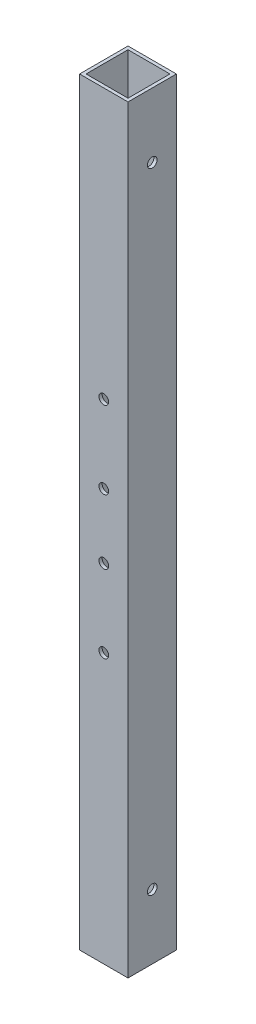
ISO-10303-21;
HEADER;
FILE_DESCRIPTION(('STEP AP214'),'2;1');
FILE_NAME('part.step','',(''),(''),'','','');
FILE_SCHEMA(('AUTOMOTIVE_DESIGN { 1 0 10303 214 1 1 1 1 }'));
ENDSEC;
DATA;
#1=APPLICATION_CONTEXT('core data for automotive mechanical design processes');
#2=APPLICATION_PROTOCOL_DEFINITION('international standard','automotive_design',2000,#1);
#3=PRODUCT_CONTEXT('',#1,'mechanical');
#4=PRODUCT('Part','Part','',(#3));
#5=PRODUCT_RELATED_PRODUCT_CATEGORY('part','',(#4));
#6=PRODUCT_DEFINITION_FORMATION('','',#4);
#7=PRODUCT_DEFINITION_CONTEXT('part definition',#1,'design');
#8=PRODUCT_DEFINITION('design','',#6,#7);
#9=PRODUCT_DEFINITION_SHAPE('','',#8);
#10=(LENGTH_UNIT() NAMED_UNIT(*) SI_UNIT(.MILLI.,.METRE.));
#11=(NAMED_UNIT(*) PLANE_ANGLE_UNIT() SI_UNIT($,.RADIAN.));
#12=(NAMED_UNIT(*) SI_UNIT($,.STERADIAN.) SOLID_ANGLE_UNIT());
#13=UNCERTAINTY_MEASURE_WITH_UNIT(LENGTH_MEASURE(1.E-05),#10,'distance_accuracy_value','');
#14=(GEOMETRIC_REPRESENTATION_CONTEXT(3) GLOBAL_UNCERTAINTY_ASSIGNED_CONTEXT((#13)) GLOBAL_UNIT_ASSIGNED_CONTEXT((#10,
#11,#12)) REPRESENTATION_CONTEXT('',''));
#15=CARTESIAN_POINT('',(0.,0.,0.));
#16=DIRECTION('',(0.,0.,1.));
#17=DIRECTION('',(1.,0.,0.));
#18=AXIS2_PLACEMENT_3D('',#15,#16,#17);
#19=CARTESIAN_POINT('',(0.,235.,0.));
#20=DIRECTION('',(0.,-1.,0.));
#21=DIRECTION('',(0.,0.,-1.));
#22=AXIS2_PLACEMENT_3D('',#19,#20,#21);
#23=PLANE('',#22);
#24=DIRECTION('',(0.,0.,-1.));
#25=VECTOR('',#24,1.);
#26=CARTESIAN_POINT('',(7.5,235.,7.5));
#27=LINE('',#26,#25);
#28=CARTESIAN_POINT('',(7.5,235.,7.5));
#29=VERTEX_POINT('',#28);
#30=CARTESIAN_POINT('',(7.5,235.,-7.5));
#31=VERTEX_POINT('',#30);
#32=EDGE_CURVE('E139',#29,#31,#27,.T.);
#33=ORIENTED_EDGE('',*,*,#32,.T.);
#34=DIRECTION('',(-1.,0.,0.));
#35=VECTOR('',#34,1.);
#36=CARTESIAN_POINT('',(-7.5,235.,-7.5));
#37=LINE('',#36,#35);
#38=CARTESIAN_POINT('',(-7.5,235.,-7.5));
#39=VERTEX_POINT('',#38);
#40=EDGE_CURVE('E142',#31,#39,#37,.T.);
#41=ORIENTED_EDGE('',*,*,#40,.T.);
#42=DIRECTION('',(0.,0.,1.));
#43=VECTOR('',#42,1.);
#44=CARTESIAN_POINT('',(-7.5,235.,7.5));
#45=LINE('',#44,#43);
#46=CARTESIAN_POINT('',(-7.5,235.,7.5));
#47=VERTEX_POINT('',#46);
#48=EDGE_CURVE('E145',#39,#47,#45,.T.);
#49=ORIENTED_EDGE('',*,*,#48,.T.);
#50=DIRECTION('',(1.,0.,0.));
#51=VECTOR('',#50,1.);
#52=CARTESIAN_POINT('',(-7.5,235.,7.5));
#53=LINE('',#52,#51);
#54=EDGE_CURVE('E147',#47,#29,#53,.T.);
#55=ORIENTED_EDGE('',*,*,#54,.T.);
#56=EDGE_LOOP('',(#33,#41,#49,#55));
#57=FACE_BOUND('',#56,.T.);
#58=DIRECTION('',(0.,0.,-1.));
#59=VECTOR('',#58,1.);
#60=CARTESIAN_POINT('',(6.5,235.,6.5));
#61=LINE('',#60,#59);
#62=CARTESIAN_POINT('',(6.5,235.,6.5));
#63=VERTEX_POINT('',#62);
#64=CARTESIAN_POINT('',(6.5,235.,-6.5));
#65=VERTEX_POINT('',#64);
#66=EDGE_CURVE('E101',#63,#65,#61,.T.);
#67=ORIENTED_EDGE('',*,*,#66,.F.);
#68=DIRECTION('',(1.,0.,0.));
#69=VECTOR('',#68,1.);
#70=CARTESIAN_POINT('',(-6.5,235.,6.5));
#71=LINE('',#70,#69);
#72=CARTESIAN_POINT('',(-6.5,235.,6.5));
#73=VERTEX_POINT('',#72);
#74=EDGE_CURVE('E123',#73,#63,#71,.T.);
#75=ORIENTED_EDGE('',*,*,#74,.F.);
#76=DIRECTION('',(0.,0.,1.));
#77=VECTOR('',#76,1.);
#78=CARTESIAN_POINT('',(-6.5,235.,6.5));
#79=LINE('',#78,#77);
#80=CARTESIAN_POINT('',(-6.5,235.,-6.5));
#81=VERTEX_POINT('',#80);
#82=EDGE_CURVE('E121',#81,#73,#79,.T.);
#83=ORIENTED_EDGE('',*,*,#82,.F.);
#84=DIRECTION('',(-1.,0.,0.));
#85=VECTOR('',#84,1.);
#86=CARTESIAN_POINT('',(-6.5,235.,-6.5));
#87=LINE('',#86,#85);
#88=EDGE_CURVE('E109',#65,#81,#87,.T.);
#89=ORIENTED_EDGE('',*,*,#88,.F.);
#90=EDGE_LOOP('',(#67,#75,#83,#89));
#91=FACE_BOUND('',#90,.T.);
#92=ADVANCED_FACE('F34',(#57,#91),#23,.F.);
#93=CARTESIAN_POINT('',(0.,0.,0.));
#94=DIRECTION('',(0.,-1.,0.));
#95=DIRECTION('',(0.,0.,-1.));
#96=AXIS2_PLACEMENT_3D('',#93,#94,#95);
#97=PLANE('',#96);
#98=DIRECTION('',(0.,0.,-1.));
#99=VECTOR('',#98,1.);
#100=CARTESIAN_POINT('',(7.5,0.,7.5));
#101=LINE('',#100,#99);
#102=CARTESIAN_POINT('',(7.5,0.,7.5));
#103=VERTEX_POINT('',#102);
#104=CARTESIAN_POINT('',(7.5,0.,-7.5));
#105=VERTEX_POINT('',#104);
#106=EDGE_CURVE('E117',#103,#105,#101,.T.);
#107=ORIENTED_EDGE('',*,*,#106,.F.);
#108=DIRECTION('',(1.,0.,0.));
#109=VECTOR('',#108,1.);
#110=CARTESIAN_POINT('',(-7.5,0.,7.5));
#111=LINE('',#110,#109);
#112=CARTESIAN_POINT('',(-7.5,0.,7.5));
#113=VERTEX_POINT('',#112);
#114=EDGE_CURVE('E143',#113,#103,#111,.T.);
#115=ORIENTED_EDGE('',*,*,#114,.F.);
#116=DIRECTION('',(0.,0.,1.));
#117=VECTOR('',#116,1.);
#118=CARTESIAN_POINT('',(-7.5,0.,7.5));
#119=LINE('',#118,#117);
#120=CARTESIAN_POINT('',(-7.5,0.,-7.5));
#121=VERTEX_POINT('',#120);
#122=EDGE_CURVE('E154',#121,#113,#119,.T.);
#123=ORIENTED_EDGE('',*,*,#122,.F.);
#124=DIRECTION('',(-1.,0.,0.));
#125=VECTOR('',#124,1.);
#126=CARTESIAN_POINT('',(-7.5,0.,-7.5));
#127=LINE('',#126,#125);
#128=EDGE_CURVE('E152',#105,#121,#127,.T.);
#129=ORIENTED_EDGE('',*,*,#128,.F.);
#130=EDGE_LOOP('',(#107,#115,#123,#129));
#131=FACE_BOUND('',#130,.T.);
#132=DIRECTION('',(1.,0.,0.));
#133=VECTOR('',#132,1.);
#134=CARTESIAN_POINT('',(-6.5,0.,6.5));
#135=LINE('',#134,#133);
#136=CARTESIAN_POINT('',(-6.5,0.,6.5));
#137=VERTEX_POINT('',#136);
#138=CARTESIAN_POINT('',(6.5,0.,6.5));
#139=VERTEX_POINT('',#138);
#140=EDGE_CURVE('E110',#137,#139,#135,.T.);
#141=ORIENTED_EDGE('',*,*,#140,.T.);
#142=DIRECTION('',(0.,0.,-1.));
#143=VECTOR('',#142,1.);
#144=CARTESIAN_POINT('',(6.5,0.,6.5));
#145=LINE('',#144,#143);
#146=CARTESIAN_POINT('',(6.5,0.,-6.5));
#147=VERTEX_POINT('',#146);
#148=EDGE_CURVE('E59',#139,#147,#145,.T.);
#149=ORIENTED_EDGE('',*,*,#148,.T.);
#150=DIRECTION('',(-1.,0.,0.));
#151=VECTOR('',#150,1.);
#152=CARTESIAN_POINT('',(-6.5,0.,-6.5));
#153=LINE('',#152,#151);
#154=CARTESIAN_POINT('',(-6.5,0.,-6.5));
#155=VERTEX_POINT('',#154);
#156=EDGE_CURVE('E116',#147,#155,#153,.T.);
#157=ORIENTED_EDGE('',*,*,#156,.T.);
#158=DIRECTION('',(0.,0.,1.));
#159=VECTOR('',#158,1.);
#160=CARTESIAN_POINT('',(-6.5,0.,6.5));
#161=LINE('',#160,#159);
#162=EDGE_CURVE('E131',#155,#137,#161,.T.);
#163=ORIENTED_EDGE('',*,*,#162,.T.);
#164=EDGE_LOOP('',(#141,#149,#157,#163));
#165=FACE_BOUND('',#164,.T.);
#166=ADVANCED_FACE('F249',(#131,#165),#97,.T.);
#167=CARTESIAN_POINT('',(7.5,235.,7.5));
#168=DIRECTION('',(-1.,0.,0.));
#169=DIRECTION('',(0.,0.,1.));
#170=AXIS2_PLACEMENT_3D('',#167,#168,#169);
#171=PLANE('',#170);
#172=CARTESIAN_POINT('',(7.5,20.,0.));
#173=DIRECTION('',(1.,0.,0.));
#174=DIRECTION('',(0.,0.,-1.));
#175=AXIS2_PLACEMENT_3D('',#172,#173,#174);
#176=CIRCLE('',#175,1.5);
#177=CARTESIAN_POINT('',(7.5,20.,-1.50000000000003));
#178=VERTEX_POINT('',#177);
#179=EDGE_CURVE('E341',#178,#178,#176,.T.);
#180=ORIENTED_EDGE('',*,*,#179,.F.);
#181=EDGE_LOOP('',(#180));
#182=FACE_BOUND('',#181,.T.);
#183=CARTESIAN_POINT('',(7.5,215.,0.));
#184=DIRECTION('',(1.,0.,0.));
#185=DIRECTION('',(0.,0.,-1.));
#186=AXIS2_PLACEMENT_3D('',#183,#184,#185);
#187=CIRCLE('',#186,1.5);
#188=CARTESIAN_POINT('',(7.5,215.,-1.50000000000001));
#189=VERTEX_POINT('',#188);
#190=EDGE_CURVE('E190',#189,#189,#187,.T.);
#191=ORIENTED_EDGE('',*,*,#190,.F.);
#192=EDGE_LOOP('',(#191));
#193=FACE_BOUND('',#192,.T.);
#194=ORIENTED_EDGE('',*,*,#106,.T.);
#195=DIRECTION('',(0.,-1.,0.));
#196=VECTOR('',#195,1.);
#197=CARTESIAN_POINT('',(7.5,235.,-7.5));
#198=LINE('',#197,#196);
#199=EDGE_CURVE('E11',#31,#105,#198,.T.);
#200=ORIENTED_EDGE('',*,*,#199,.F.);
#201=ORIENTED_EDGE('',*,*,#32,.F.);
#202=DIRECTION('',(0.,-1.,0.));
#203=VECTOR('',#202,1.);
#204=CARTESIAN_POINT('',(7.5,235.,7.5));
#205=LINE('',#204,#203);
#206=EDGE_CURVE('E149',#29,#103,#205,.T.);
#207=ORIENTED_EDGE('',*,*,#206,.T.);
#208=EDGE_LOOP('',(#194,#200,#201,#207));
#209=FACE_BOUND('',#208,.T.);
#210=ADVANCED_FACE('F36',(#182,#193,#209),#171,.F.);
#211=CARTESIAN_POINT('',(-7.5,235.,-7.5));
#212=DIRECTION('',(0.,0.,1.));
#213=DIRECTION('',(1.,0.,0.));
#214=AXIS2_PLACEMENT_3D('',#211,#212,#213);
#215=PLANE('',#214);
#216=CARTESIAN_POINT('',(0.,83.5,-7.5));
#217=DIRECTION('',(0.,0.,1.));
#218=DIRECTION('',(1.,0.,0.));
#219=AXIS2_PLACEMENT_3D('',#216,#217,#218);
#220=CIRCLE('',#219,1.5);
#221=CARTESIAN_POINT('',(1.50000000000001,83.5,-7.5));
#222=VERTEX_POINT('',#221);
#223=EDGE_CURVE('E207',#222,#222,#220,.T.);
#224=ORIENTED_EDGE('',*,*,#223,.T.);
#225=EDGE_LOOP('',(#224));
#226=FACE_BOUND('',#225,.T.);
#227=CARTESIAN_POINT('',(0.,151.5,-7.5));
#228=DIRECTION('',(0.,0.,1.));
#229=DIRECTION('',(1.,0.,0.));
#230=AXIS2_PLACEMENT_3D('',#227,#228,#229);
#231=CIRCLE('',#230,1.5);
#232=CARTESIAN_POINT('',(1.50000000000001,151.5,-7.5));
#233=VERTEX_POINT('',#232);
#234=EDGE_CURVE('E200',#233,#233,#231,.T.);
#235=ORIENTED_EDGE('',*,*,#234,.T.);
#236=EDGE_LOOP('',(#235));
#237=FACE_BOUND('',#236,.T.);
#238=CARTESIAN_POINT('',(0.,107.5,-7.5));
#239=DIRECTION('',(0.,0.,1.));
#240=DIRECTION('',(1.,0.,0.));
#241=AXIS2_PLACEMENT_3D('',#238,#239,#240);
#242=CIRCLE('',#241,1.5);
#243=CARTESIAN_POINT('',(1.50000000000002,107.5,-7.5));
#244=VERTEX_POINT('',#243);
#245=EDGE_CURVE('E172',#244,#244,#242,.T.);
#246=ORIENTED_EDGE('',*,*,#245,.T.);
#247=EDGE_LOOP('',(#246));
#248=FACE_BOUND('',#247,.T.);
#249=CARTESIAN_POINT('',(0.,127.5,-7.5));
#250=DIRECTION('',(0.,0.,1.));
#251=DIRECTION('',(1.,0.,0.));
#252=AXIS2_PLACEMENT_3D('',#249,#250,#251);
#253=CIRCLE('',#252,1.5);
#254=CARTESIAN_POINT('',(1.50000000000002,127.5,-7.5));
#255=VERTEX_POINT('',#254);
#256=EDGE_CURVE('E167',#255,#255,#253,.T.);
#257=ORIENTED_EDGE('',*,*,#256,.T.);
#258=EDGE_LOOP('',(#257));
#259=FACE_BOUND('',#258,.T.);
#260=ORIENTED_EDGE('',*,*,#128,.T.);
#261=DIRECTION('',(0.,-1.,0.));
#262=VECTOR('',#261,1.);
#263=CARTESIAN_POINT('',(-7.5,235.,-7.5));
#264=LINE('',#263,#262);
#265=EDGE_CURVE('E43',#39,#121,#264,.T.);
#266=ORIENTED_EDGE('',*,*,#265,.F.);
#267=ORIENTED_EDGE('',*,*,#40,.F.);
#268=ORIENTED_EDGE('',*,*,#199,.T.);
#269=EDGE_LOOP('',(#260,#266,#267,#268));
#270=FACE_BOUND('',#269,.T.);
#271=ADVANCED_FACE('F263',(#226,#237,#248,#259,#270),#215,.F.);
#272=CARTESIAN_POINT('',(-7.5,235.,7.5));
#273=DIRECTION('',(1.,0.,0.));
#274=DIRECTION('',(0.,0.,-1.));
#275=AXIS2_PLACEMENT_3D('',#272,#273,#274);
#276=PLANE('',#275);
#277=CARTESIAN_POINT('',(-7.5,20.,0.));
#278=DIRECTION('',(1.,0.,0.));
#279=DIRECTION('',(0.,0.,-1.));
#280=AXIS2_PLACEMENT_3D('',#277,#278,#279);
#281=CIRCLE('',#280,1.5);
#282=CARTESIAN_POINT('',(-7.5,20.,-1.50000000000003));
#283=VERTEX_POINT('',#282);
#284=EDGE_CURVE('E340',#283,#283,#281,.T.);
#285=ORIENTED_EDGE('',*,*,#284,.T.);
#286=EDGE_LOOP('',(#285));
#287=FACE_BOUND('',#286,.T.);
#288=CARTESIAN_POINT('',(-7.5,215.,0.));
#289=DIRECTION('',(1.,0.,0.));
#290=DIRECTION('',(0.,0.,-1.));
#291=AXIS2_PLACEMENT_3D('',#288,#289,#290);
#292=CIRCLE('',#291,1.5);
#293=CARTESIAN_POINT('',(-7.5,215.,-1.50000000000001));
#294=VERTEX_POINT('',#293);
#295=EDGE_CURVE('E183',#294,#294,#292,.T.);
#296=ORIENTED_EDGE('',*,*,#295,.T.);
#297=EDGE_LOOP('',(#296));
#298=FACE_BOUND('',#297,.T.);
#299=ORIENTED_EDGE('',*,*,#122,.T.);
#300=DIRECTION('',(0.,-1.,0.));
#301=VECTOR('',#300,1.);
#302=CARTESIAN_POINT('',(-7.5,235.,7.5));
#303=LINE('',#302,#301);
#304=EDGE_CURVE('E159',#47,#113,#303,.T.);
#305=ORIENTED_EDGE('',*,*,#304,.F.);
#306=ORIENTED_EDGE('',*,*,#48,.F.);
#307=ORIENTED_EDGE('',*,*,#265,.T.);
#308=EDGE_LOOP('',(#299,#305,#306,#307));
#309=FACE_BOUND('',#308,.T.);
#310=ADVANCED_FACE('F260',(#287,#298,#309),#276,.F.);
#311=CARTESIAN_POINT('',(-7.5,235.,7.5));
#312=DIRECTION('',(0.,0.,-1.));
#313=DIRECTION('',(-1.,0.,0.));
#314=AXIS2_PLACEMENT_3D('',#311,#312,#313);
#315=PLANE('',#314);
#316=CARTESIAN_POINT('',(0.,83.5,7.5));
#317=DIRECTION('',(0.,0.,1.));
#318=DIRECTION('',(1.,0.,0.));
#319=AXIS2_PLACEMENT_3D('',#316,#317,#318);
#320=CIRCLE('',#319,1.5);
#321=CARTESIAN_POINT('',(1.50000000000001,83.5,7.5));
#322=VERTEX_POINT('',#321);
#323=EDGE_CURVE('E187',#322,#322,#320,.T.);
#324=ORIENTED_EDGE('',*,*,#323,.F.);
#325=EDGE_LOOP('',(#324));
#326=FACE_BOUND('',#325,.T.);
#327=CARTESIAN_POINT('',(0.,151.5,7.5));
#328=DIRECTION('',(0.,0.,1.));
#329=DIRECTION('',(1.,0.,0.));
#330=AXIS2_PLACEMENT_3D('',#327,#328,#329);
#331=CIRCLE('',#330,1.5);
#332=CARTESIAN_POINT('',(1.50000000000001,151.5,7.5));
#333=VERTEX_POINT('',#332);
#334=EDGE_CURVE('E204',#333,#333,#331,.T.);
#335=ORIENTED_EDGE('',*,*,#334,.F.);
#336=EDGE_LOOP('',(#335));
#337=FACE_BOUND('',#336,.T.);
#338=CARTESIAN_POINT('',(0.,107.5,7.5));
#339=DIRECTION('',(0.,0.,1.));
#340=DIRECTION('',(1.,0.,0.));
#341=AXIS2_PLACEMENT_3D('',#338,#339,#340);
#342=CIRCLE('',#341,1.5);
#343=CARTESIAN_POINT('',(1.50000000000002,107.5,7.5));
#344=VERTEX_POINT('',#343);
#345=EDGE_CURVE('E203',#344,#344,#342,.T.);
#346=ORIENTED_EDGE('',*,*,#345,.F.);
#347=EDGE_LOOP('',(#346));
#348=FACE_BOUND('',#347,.T.);
#349=CARTESIAN_POINT('',(0.,127.5,7.5));
#350=DIRECTION('',(0.,0.,1.));
#351=DIRECTION('',(1.,0.,0.));
#352=AXIS2_PLACEMENT_3D('',#349,#350,#351);
#353=CIRCLE('',#352,1.5);
#354=CARTESIAN_POINT('',(1.50000000000002,127.5,7.5));
#355=VERTEX_POINT('',#354);
#356=EDGE_CURVE('E222',#355,#355,#353,.T.);
#357=ORIENTED_EDGE('',*,*,#356,.F.);
#358=EDGE_LOOP('',(#357));
#359=FACE_BOUND('',#358,.T.);
#360=ORIENTED_EDGE('',*,*,#114,.T.);
#361=ORIENTED_EDGE('',*,*,#206,.F.);
#362=ORIENTED_EDGE('',*,*,#54,.F.);
#363=ORIENTED_EDGE('',*,*,#304,.T.);
#364=EDGE_LOOP('',(#360,#361,#362,#363));
#365=FACE_BOUND('',#364,.T.);
#366=ADVANCED_FACE('F243',(#326,#337,#348,#359,#365),#315,.F.);
#367=CARTESIAN_POINT('',(6.5,235.,6.5));
#368=DIRECTION('',(-1.,0.,0.));
#369=DIRECTION('',(0.,0.,1.));
#370=AXIS2_PLACEMENT_3D('',#367,#368,#369);
#371=PLANE('',#370);
#372=CARTESIAN_POINT('',(6.5,20.,0.));
#373=DIRECTION('',(-1.,0.,0.));
#374=DIRECTION('',(0.,0.,1.));
#375=AXIS2_PLACEMENT_3D('',#372,#373,#374);
#376=CIRCLE('',#375,1.5);
#377=CARTESIAN_POINT('',(6.5,20.,1.49999999999997));
#378=VERTEX_POINT('',#377);
#379=EDGE_CURVE('E195',#378,#378,#376,.T.);
#380=ORIENTED_EDGE('',*,*,#379,.F.);
#381=EDGE_LOOP('',(#380));
#382=FACE_BOUND('',#381,.T.);
#383=CARTESIAN_POINT('',(6.5,215.,0.));
#384=DIRECTION('',(-1.,0.,0.));
#385=DIRECTION('',(0.,0.,1.));
#386=AXIS2_PLACEMENT_3D('',#383,#384,#385);
#387=CIRCLE('',#386,1.5);
#388=CARTESIAN_POINT('',(6.5,215.,1.49999999999999));
#389=VERTEX_POINT('',#388);
#390=EDGE_CURVE('E182',#389,#389,#387,.T.);
#391=ORIENTED_EDGE('',*,*,#390,.F.);
#392=EDGE_LOOP('',(#391));
#393=FACE_BOUND('',#392,.T.);
#394=ORIENTED_EDGE('',*,*,#148,.F.);
#395=DIRECTION('',(0.,-1.,0.));
#396=VECTOR('',#395,1.);
#397=CARTESIAN_POINT('',(6.5,235.,6.5));
#398=LINE('',#397,#396);
#399=EDGE_CURVE('E105',#63,#139,#398,.T.);
#400=ORIENTED_EDGE('',*,*,#399,.F.);
#401=ORIENTED_EDGE('',*,*,#66,.T.);
#402=DIRECTION('',(0.,-1.,0.));
#403=VECTOR('',#402,1.);
#404=CARTESIAN_POINT('',(6.5,235.,-6.5));
#405=LINE('',#404,#403);
#406=EDGE_CURVE('E104',#65,#147,#405,.T.);
#407=ORIENTED_EDGE('',*,*,#406,.T.);
#408=EDGE_LOOP('',(#394,#400,#401,#407));
#409=FACE_BOUND('',#408,.T.);
#410=ADVANCED_FACE('F103',(#382,#393,#409),#371,.T.);
#411=CARTESIAN_POINT('',(-6.5,235.,-6.5));
#412=DIRECTION('',(0.,0.,1.));
#413=DIRECTION('',(1.,0.,0.));
#414=AXIS2_PLACEMENT_3D('',#411,#412,#413);
#415=PLANE('',#414);
#416=CARTESIAN_POINT('',(0.,83.5,-6.5));
#417=DIRECTION('',(0.,0.,1.));
#418=DIRECTION('',(1.,0.,0.));
#419=AXIS2_PLACEMENT_3D('',#416,#417,#418);
#420=CIRCLE('',#419,1.5);
#421=CARTESIAN_POINT('',(1.50000000000001,83.5,-6.5));
#422=VERTEX_POINT('',#421);
#423=EDGE_CURVE('E179',#422,#422,#420,.T.);
#424=ORIENTED_EDGE('',*,*,#423,.F.);
#425=EDGE_LOOP('',(#424));
#426=FACE_BOUND('',#425,.T.);
#427=CARTESIAN_POINT('',(0.,151.5,-6.5));
#428=DIRECTION('',(0.,0.,1.));
#429=DIRECTION('',(1.,0.,0.));
#430=AXIS2_PLACEMENT_3D('',#427,#428,#429);
#431=CIRCLE('',#430,1.5);
#432=CARTESIAN_POINT('',(1.50000000000001,151.5,-6.5));
#433=VERTEX_POINT('',#432);
#434=EDGE_CURVE('E176',#433,#433,#431,.T.);
#435=ORIENTED_EDGE('',*,*,#434,.F.);
#436=EDGE_LOOP('',(#435));
#437=FACE_BOUND('',#436,.T.);
#438=CARTESIAN_POINT('',(0.,107.5,-6.5));
#439=DIRECTION('',(0.,0.,1.));
#440=DIRECTION('',(1.,0.,0.));
#441=AXIS2_PLACEMENT_3D('',#438,#439,#440);
#442=CIRCLE('',#441,1.5);
#443=CARTESIAN_POINT('',(1.50000000000002,107.5,-6.5));
#444=VERTEX_POINT('',#443);
#445=EDGE_CURVE('E171',#444,#444,#442,.T.);
#446=ORIENTED_EDGE('',*,*,#445,.F.);
#447=EDGE_LOOP('',(#446));
#448=FACE_BOUND('',#447,.T.);
#449=CARTESIAN_POINT('',(0.,127.5,-6.5));
#450=DIRECTION('',(0.,0.,1.));
#451=DIRECTION('',(1.,0.,0.));
#452=AXIS2_PLACEMENT_3D('',#449,#450,#451);
#453=CIRCLE('',#452,1.5);
#454=CARTESIAN_POINT('',(1.50000000000002,127.5,-6.5));
#455=VERTEX_POINT('',#454);
#456=EDGE_CURVE('E129',#455,#455,#453,.T.);
#457=ORIENTED_EDGE('',*,*,#456,.F.);
#458=EDGE_LOOP('',(#457));
#459=FACE_BOUND('',#458,.T.);
#460=ORIENTED_EDGE('',*,*,#156,.F.);
#461=ORIENTED_EDGE('',*,*,#406,.F.);
#462=ORIENTED_EDGE('',*,*,#88,.T.);
#463=DIRECTION('',(0.,-1.,0.));
#464=VECTOR('',#463,1.);
#465=CARTESIAN_POINT('',(-6.5,235.,-6.5));
#466=LINE('',#465,#464);
#467=EDGE_CURVE('E118',#81,#155,#466,.T.);
#468=ORIENTED_EDGE('',*,*,#467,.T.);
#469=EDGE_LOOP('',(#460,#461,#462,#468));
#470=FACE_BOUND('',#469,.T.);
#471=ADVANCED_FACE('F113',(#426,#437,#448,#459,#470),#415,.T.);
#472=CARTESIAN_POINT('',(-6.5,235.,6.5));
#473=DIRECTION('',(1.,0.,0.));
#474=DIRECTION('',(0.,0.,-1.));
#475=AXIS2_PLACEMENT_3D('',#472,#473,#474);
#476=PLANE('',#475);
#477=CARTESIAN_POINT('',(-6.5,20.,0.));
#478=DIRECTION('',(1.,0.,0.));
#479=DIRECTION('',(0.,0.,-1.));
#480=AXIS2_PLACEMENT_3D('',#477,#478,#479);
#481=CIRCLE('',#480,1.5);
#482=CARTESIAN_POINT('',(-6.5,20.,-1.50000000000003));
#483=VERTEX_POINT('',#482);
#484=EDGE_CURVE('E38',#483,#483,#481,.T.);
#485=ORIENTED_EDGE('',*,*,#484,.F.);
#486=EDGE_LOOP('',(#485));
#487=FACE_BOUND('',#486,.T.);
#488=CARTESIAN_POINT('',(-6.5,215.,0.));
#489=DIRECTION('',(1.,0.,0.));
#490=DIRECTION('',(0.,0.,-1.));
#491=AXIS2_PLACEMENT_3D('',#488,#489,#490);
#492=CIRCLE('',#491,1.5);
#493=CARTESIAN_POINT('',(-6.5,215.,-1.50000000000001));
#494=VERTEX_POINT('',#493);
#495=EDGE_CURVE('E180',#494,#494,#492,.T.);
#496=ORIENTED_EDGE('',*,*,#495,.F.);
#497=EDGE_LOOP('',(#496));
#498=FACE_BOUND('',#497,.T.);
#499=ORIENTED_EDGE('',*,*,#162,.F.);
#500=ORIENTED_EDGE('',*,*,#467,.F.);
#501=ORIENTED_EDGE('',*,*,#82,.T.);
#502=DIRECTION('',(0.,-1.,0.));
#503=VECTOR('',#502,1.);
#504=CARTESIAN_POINT('',(-6.5,235.,6.5));
#505=LINE('',#504,#503);
#506=EDGE_CURVE('E51',#73,#137,#505,.T.);
#507=ORIENTED_EDGE('',*,*,#506,.T.);
#508=EDGE_LOOP('',(#499,#500,#501,#507));
#509=FACE_BOUND('',#508,.T.);
#510=ADVANCED_FACE('F233',(#487,#498,#509),#476,.T.);
#511=CARTESIAN_POINT('',(-6.5,235.,6.5));
#512=DIRECTION('',(0.,0.,-1.));
#513=DIRECTION('',(-1.,0.,0.));
#514=AXIS2_PLACEMENT_3D('',#511,#512,#513);
#515=PLANE('',#514);
#516=CARTESIAN_POINT('',(0.,83.5,6.50000000000001));
#517=DIRECTION('',(0.,0.,-1.));
#518=DIRECTION('',(-1.,0.,0.));
#519=AXIS2_PLACEMENT_3D('',#516,#517,#518);
#520=CIRCLE('',#519,1.5);
#521=CARTESIAN_POINT('',(-1.49999999999999,83.5,6.50000000000001));
#522=VERTEX_POINT('',#521);
#523=EDGE_CURVE('E177',#522,#522,#520,.T.);
#524=ORIENTED_EDGE('',*,*,#523,.F.);
#525=EDGE_LOOP('',(#524));
#526=FACE_BOUND('',#525,.T.);
#527=CARTESIAN_POINT('',(0.,151.5,6.50000000000001));
#528=DIRECTION('',(0.,0.,-1.));
#529=DIRECTION('',(-1.,0.,0.));
#530=AXIS2_PLACEMENT_3D('',#527,#528,#529);
#531=CIRCLE('',#530,1.5);
#532=CARTESIAN_POINT('',(-1.49999999999999,151.5,6.50000000000001));
#533=VERTEX_POINT('',#532);
#534=EDGE_CURVE('E173',#533,#533,#531,.T.);
#535=ORIENTED_EDGE('',*,*,#534,.F.);
#536=EDGE_LOOP('',(#535));
#537=FACE_BOUND('',#536,.T.);
#538=CARTESIAN_POINT('',(0.,107.5,6.50000000000001));
#539=DIRECTION('',(0.,0.,-1.));
#540=DIRECTION('',(-1.,0.,0.));
#541=AXIS2_PLACEMENT_3D('',#538,#539,#540);
#542=CIRCLE('',#541,1.5);
#543=CARTESIAN_POINT('',(-1.49999999999998,107.5,6.50000000000001));
#544=VERTEX_POINT('',#543);
#545=EDGE_CURVE('E168',#544,#544,#542,.T.);
#546=ORIENTED_EDGE('',*,*,#545,.F.);
#547=EDGE_LOOP('',(#546));
#548=FACE_BOUND('',#547,.T.);
#549=CARTESIAN_POINT('',(0.,127.5,6.50000000000001));
#550=DIRECTION('',(0.,0.,-1.));
#551=DIRECTION('',(-1.,0.,0.));
#552=AXIS2_PLACEMENT_3D('',#549,#550,#551);
#553=CIRCLE('',#552,1.5);
#554=CARTESIAN_POINT('',(-1.49999999999998,127.5,6.50000000000001));
#555=VERTEX_POINT('',#554);
#556=EDGE_CURVE('E164',#555,#555,#553,.T.);
#557=ORIENTED_EDGE('',*,*,#556,.F.);
#558=EDGE_LOOP('',(#557));
#559=FACE_BOUND('',#558,.T.);
#560=ORIENTED_EDGE('',*,*,#140,.F.);
#561=ORIENTED_EDGE('',*,*,#506,.F.);
#562=ORIENTED_EDGE('',*,*,#74,.T.);
#563=ORIENTED_EDGE('',*,*,#399,.T.);
#564=EDGE_LOOP('',(#560,#561,#562,#563));
#565=FACE_BOUND('',#564,.T.);
#566=ADVANCED_FACE('F240',(#526,#537,#548,#559,#565),#515,.T.);
#567=CARTESIAN_POINT('',(0.,127.5,-7.5));
#568=DIRECTION('',(0.,0.,1.));
#569=DIRECTION('',(1.,0.,0.));
#570=AXIS2_PLACEMENT_3D('',#567,#568,#569);
#571=CYLINDRICAL_SURFACE('',#570,1.5);
#572=ORIENTED_EDGE('',*,*,#556,.T.);
#573=EDGE_LOOP('',(#572));
#574=FACE_BOUND('',#573,.T.);
#575=ORIENTED_EDGE('',*,*,#356,.T.);
#576=EDGE_LOOP('',(#575));
#577=FACE_BOUND('',#576,.T.);
#578=ADVANCED_FACE('F295',(#574,#577),#571,.F.);
#579=ORIENTED_EDGE('',*,*,#456,.T.);
#580=EDGE_LOOP('',(#579));
#581=FACE_BOUND('',#580,.T.);
#582=ORIENTED_EDGE('',*,*,#256,.F.);
#583=EDGE_LOOP('',(#582));
#584=FACE_BOUND('',#583,.T.);
#585=ADVANCED_FACE('F229',(#581,#584),#571,.F.);
#586=CARTESIAN_POINT('',(0.,107.5,-7.5));
#587=DIRECTION('',(0.,0.,1.));
#588=DIRECTION('',(1.,0.,0.));
#589=AXIS2_PLACEMENT_3D('',#586,#587,#588);
#590=CYLINDRICAL_SURFACE('',#589,1.5);
#591=ORIENTED_EDGE('',*,*,#545,.T.);
#592=EDGE_LOOP('',(#591));
#593=FACE_BOUND('',#592,.T.);
#594=ORIENTED_EDGE('',*,*,#345,.T.);
#595=EDGE_LOOP('',(#594));
#596=FACE_BOUND('',#595,.T.);
#597=ADVANCED_FACE('F306',(#593,#596),#590,.F.);
#598=CARTESIAN_POINT('',(0.,151.5,-7.5));
#599=DIRECTION('',(0.,0.,1.));
#600=DIRECTION('',(1.,0.,0.));
#601=AXIS2_PLACEMENT_3D('',#598,#599,#600);
#602=CYLINDRICAL_SURFACE('',#601,1.5);
#603=ORIENTED_EDGE('',*,*,#534,.T.);
#604=EDGE_LOOP('',(#603));
#605=FACE_BOUND('',#604,.T.);
#606=ORIENTED_EDGE('',*,*,#334,.T.);
#607=EDGE_LOOP('',(#606));
#608=FACE_BOUND('',#607,.T.);
#609=ADVANCED_FACE('F309',(#605,#608),#602,.F.);
#610=CARTESIAN_POINT('',(0.,83.5,-7.5));
#611=DIRECTION('',(0.,0.,1.));
#612=DIRECTION('',(1.,0.,0.));
#613=AXIS2_PLACEMENT_3D('',#610,#611,#612);
#614=CYLINDRICAL_SURFACE('',#613,1.5);
#615=ORIENTED_EDGE('',*,*,#523,.T.);
#616=EDGE_LOOP('',(#615));
#617=FACE_BOUND('',#616,.T.);
#618=ORIENTED_EDGE('',*,*,#323,.T.);
#619=EDGE_LOOP('',(#618));
#620=FACE_BOUND('',#619,.T.);
#621=ADVANCED_FACE('F312',(#617,#620),#614,.F.);
#622=ORIENTED_EDGE('',*,*,#445,.T.);
#623=EDGE_LOOP('',(#622));
#624=FACE_BOUND('',#623,.T.);
#625=ORIENTED_EDGE('',*,*,#245,.F.);
#626=EDGE_LOOP('',(#625));
#627=FACE_BOUND('',#626,.T.);
#628=ADVANCED_FACE('F311',(#624,#627),#590,.F.);
#629=ORIENTED_EDGE('',*,*,#434,.T.);
#630=EDGE_LOOP('',(#629));
#631=FACE_BOUND('',#630,.T.);
#632=ORIENTED_EDGE('',*,*,#234,.F.);
#633=EDGE_LOOP('',(#632));
#634=FACE_BOUND('',#633,.T.);
#635=ADVANCED_FACE('F320',(#631,#634),#602,.F.);
#636=ORIENTED_EDGE('',*,*,#423,.T.);
#637=EDGE_LOOP('',(#636));
#638=FACE_BOUND('',#637,.T.);
#639=ORIENTED_EDGE('',*,*,#223,.F.);
#640=EDGE_LOOP('',(#639));
#641=FACE_BOUND('',#640,.T.);
#642=ADVANCED_FACE('F316',(#638,#641),#614,.F.);
#643=CARTESIAN_POINT('',(-7.5,215.,0.));
#644=DIRECTION('',(1.,0.,0.));
#645=DIRECTION('',(0.,0.,-1.));
#646=AXIS2_PLACEMENT_3D('',#643,#644,#645);
#647=CYLINDRICAL_SURFACE('',#646,1.5);
#648=ORIENTED_EDGE('',*,*,#495,.T.);
#649=EDGE_LOOP('',(#648));
#650=FACE_BOUND('',#649,.T.);
#651=ORIENTED_EDGE('',*,*,#295,.F.);
#652=EDGE_LOOP('',(#651));
#653=FACE_BOUND('',#652,.T.);
#654=ADVANCED_FACE('F321',(#650,#653),#647,.F.);
#655=ORIENTED_EDGE('',*,*,#390,.T.);
#656=EDGE_LOOP('',(#655));
#657=FACE_BOUND('',#656,.T.);
#658=ORIENTED_EDGE('',*,*,#190,.T.);
#659=EDGE_LOOP('',(#658));
#660=FACE_BOUND('',#659,.T.);
#661=ADVANCED_FACE('F324',(#657,#660),#647,.F.);
#662=CARTESIAN_POINT('',(-7.5,20.,0.));
#663=DIRECTION('',(1.,0.,0.));
#664=DIRECTION('',(0.,0.,-1.));
#665=AXIS2_PLACEMENT_3D('',#662,#663,#664);
#666=CYLINDRICAL_SURFACE('',#665,1.5);
#667=ORIENTED_EDGE('',*,*,#484,.T.);
#668=EDGE_LOOP('',(#667));
#669=FACE_BOUND('',#668,.T.);
#670=ORIENTED_EDGE('',*,*,#284,.F.);
#671=EDGE_LOOP('',(#670));
#672=FACE_BOUND('',#671,.T.);
#673=ADVANCED_FACE('F325',(#669,#672),#666,.F.);
#674=ORIENTED_EDGE('',*,*,#379,.T.);
#675=EDGE_LOOP('',(#674));
#676=FACE_BOUND('',#675,.T.);
#677=ORIENTED_EDGE('',*,*,#179,.T.);
#678=EDGE_LOOP('',(#677));
#679=FACE_BOUND('',#678,.T.);
#680=ADVANCED_FACE('F327',(#676,#679),#666,.F.);
#681=CLOSED_SHELL('',(#92,#166,#210,#271,#310,#366,#410,#471,#510,#566,#578,#585,#597,#609,#621,
#628,#635,#642,#654,#661,#673,#680));
#682=MANIFOLD_SOLID_BREP('B2',#681);
#683=ADVANCED_BREP_SHAPE_REPRESENTATION('',(#18,#682),#14);
#684=SHAPE_DEFINITION_REPRESENTATION(#9,#683);
ENDSEC;
END-ISO-10303-21;
